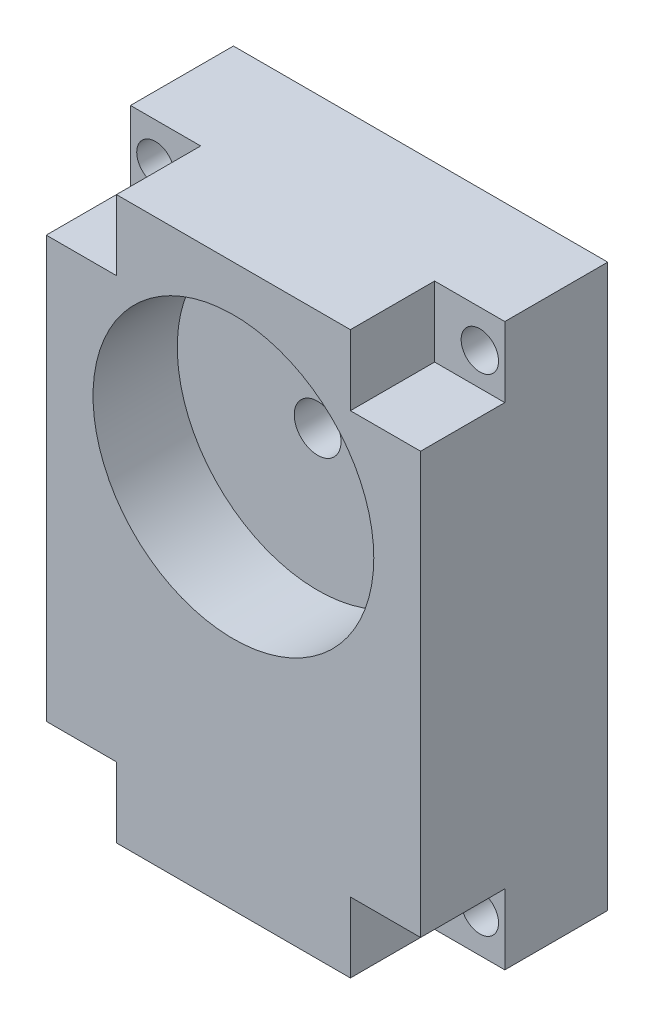
ISO-10303-21;
HEADER;
FILE_DESCRIPTION(('STEP AP214'),'2;1');
FILE_NAME('part.step','',(''),(''),'','','');
FILE_SCHEMA(('AUTOMOTIVE_DESIGN { 1 0 10303 214 1 1 1 1 }'));
ENDSEC;
DATA;
#1=APPLICATION_CONTEXT('core data for automotive mechanical design processes');
#2=APPLICATION_PROTOCOL_DEFINITION('international standard','automotive_design',2000,#1);
#3=PRODUCT_CONTEXT('',#1,'mechanical');
#4=PRODUCT('Part','Part','',(#3));
#5=PRODUCT_RELATED_PRODUCT_CATEGORY('part','',(#4));
#6=PRODUCT_DEFINITION_FORMATION('','',#4);
#7=PRODUCT_DEFINITION_CONTEXT('part definition',#1,'design');
#8=PRODUCT_DEFINITION('design','',#6,#7);
#9=PRODUCT_DEFINITION_SHAPE('','',#8);
#10=(LENGTH_UNIT() NAMED_UNIT(*) SI_UNIT(.MILLI.,.METRE.));
#11=(NAMED_UNIT(*) PLANE_ANGLE_UNIT() SI_UNIT($,.RADIAN.));
#12=(NAMED_UNIT(*) SI_UNIT($,.STERADIAN.) SOLID_ANGLE_UNIT());
#13=UNCERTAINTY_MEASURE_WITH_UNIT(LENGTH_MEASURE(1.E-05),#10,'distance_accuracy_value','');
#14=(GEOMETRIC_REPRESENTATION_CONTEXT(3) GLOBAL_UNCERTAINTY_ASSIGNED_CONTEXT((#13)) GLOBAL_UNIT_ASSIGNED_CONTEXT((#10,
#11,#12)) REPRESENTATION_CONTEXT('',''));
#15=CARTESIAN_POINT('',(0.,0.,0.));
#16=DIRECTION('',(0.,0.,1.));
#17=DIRECTION('',(1.,0.,0.));
#18=AXIS2_PLACEMENT_3D('',#15,#16,#17);
#19=CARTESIAN_POINT('',(0.,0.,0.));
#20=DIRECTION('',(0.,0.,1.));
#21=DIRECTION('',(1.,0.,0.));
#22=AXIS2_PLACEMENT_3D('',#19,#20,#21);
#23=PLANE('',#22);
#24=CARTESIAN_POINT('',(0.,10.125,0.));
#25=DIRECTION('',(0.,0.,1.));
#26=DIRECTION('',(1.,0.,0.));
#27=AXIS2_PLACEMENT_3D('',#24,#25,#26);
#28=CIRCLE('',#27,2.5);
#29=CARTESIAN_POINT('',(2.5,10.125,0.));
#30=VERTEX_POINT('',#29);
#31=EDGE_CURVE('E198',#30,#30,#28,.T.);
#32=ORIENTED_EDGE('',*,*,#31,.T.);
#33=EDGE_LOOP('',(#32));
#34=FACE_BOUND('',#33,.T.);
#35=CARTESIAN_POINT('',(-17.3333333333333,-26.,0.));
#36=DIRECTION('',(0.,0.,1.));
#37=DIRECTION('',(1.,0.,0.));
#38=AXIS2_PLACEMENT_3D('',#35,#36,#37);
#39=CIRCLE('',#38,2.);
#40=CARTESIAN_POINT('',(-15.3333333333333,-26.,0.));
#41=VERTEX_POINT('',#40);
#42=EDGE_CURVE('E290',#41,#41,#39,.T.);
#43=ORIENTED_EDGE('',*,*,#42,.T.);
#44=EDGE_LOOP('',(#43));
#45=FACE_BOUND('',#44,.T.);
#46=CARTESIAN_POINT('',(17.3333333333333,-26.,0.));
#47=DIRECTION('',(0.,0.,1.));
#48=DIRECTION('',(1.,0.,0.));
#49=AXIS2_PLACEMENT_3D('',#46,#47,#48);
#50=CIRCLE('',#49,2.);
#51=CARTESIAN_POINT('',(19.3333333333333,-26.,0.));
#52=VERTEX_POINT('',#51);
#53=EDGE_CURVE('E287',#52,#52,#50,.F.);
#54=ORIENTED_EDGE('',*,*,#53,.F.);
#55=EDGE_LOOP('',(#54));
#56=FACE_BOUND('',#55,.T.);
#57=CARTESIAN_POINT('',(-17.3333333333333,26.,0.));
#58=DIRECTION('',(0.,0.,1.));
#59=DIRECTION('',(1.,0.,0.));
#60=AXIS2_PLACEMENT_3D('',#57,#58,#59);
#61=CIRCLE('',#60,2.);
#62=CARTESIAN_POINT('',(-15.3333333333333,26.,0.));
#63=VERTEX_POINT('',#62);
#64=EDGE_CURVE('E244',#63,#63,#61,.F.);
#65=ORIENTED_EDGE('',*,*,#64,.F.);
#66=EDGE_LOOP('',(#65));
#67=FACE_BOUND('',#66,.T.);
#68=DIRECTION('',(0.,-1.,0.));
#69=VECTOR('',#68,1.);
#70=CARTESIAN_POINT('',(-20.,-30.,0.));
#71=LINE('',#70,#69);
#72=CARTESIAN_POINT('',(-20.,30.,0.));
#73=VERTEX_POINT('',#72);
#74=CARTESIAN_POINT('',(-20.,-30.,0.));
#75=VERTEX_POINT('',#74);
#76=EDGE_CURVE('E252',#73,#75,#71,.T.);
#77=ORIENTED_EDGE('',*,*,#76,.F.);
#78=DIRECTION('',(-1.,0.,0.));
#79=VECTOR('',#78,1.);
#80=CARTESIAN_POINT('',(20.,30.,0.));
#81=LINE('',#80,#79);
#82=CARTESIAN_POINT('',(20.,30.,0.));
#83=VERTEX_POINT('',#82);
#84=EDGE_CURVE('E260',#83,#73,#81,.T.);
#85=ORIENTED_EDGE('',*,*,#84,.F.);
#86=DIRECTION('',(0.,1.,0.));
#87=VECTOR('',#86,1.);
#88=CARTESIAN_POINT('',(20.,-30.,0.));
#89=LINE('',#88,#87);
#90=CARTESIAN_POINT('',(20.,-30.,0.));
#91=VERTEX_POINT('',#90);
#92=EDGE_CURVE('E273',#91,#83,#89,.T.);
#93=ORIENTED_EDGE('',*,*,#92,.F.);
#94=DIRECTION('',(1.,0.,0.));
#95=VECTOR('',#94,1.);
#96=CARTESIAN_POINT('',(20.,-30.,0.));
#97=LINE('',#96,#95);
#98=EDGE_CURVE('E270',#75,#91,#97,.T.);
#99=ORIENTED_EDGE('',*,*,#98,.F.);
#100=EDGE_LOOP('',(#77,#85,#93,#99));
#101=FACE_BOUND('',#100,.T.);
#102=CARTESIAN_POINT('',(17.3333333333333,26.,0.));
#103=DIRECTION('',(0.,0.,1.));
#104=DIRECTION('',(1.,0.,0.));
#105=AXIS2_PLACEMENT_3D('',#102,#103,#104);
#106=CIRCLE('',#105,2.);
#107=CARTESIAN_POINT('',(19.3333333333333,26.,0.));
#108=VERTEX_POINT('',#107);
#109=EDGE_CURVE('E256',#108,#108,#106,.T.);
#110=ORIENTED_EDGE('',*,*,#109,.T.);
#111=EDGE_LOOP('',(#110));
#112=FACE_BOUND('',#111,.T.);
#113=ADVANCED_FACE('F33',(#34,#45,#56,#67,#101,#112),#23,.F.);
#114=CARTESIAN_POINT('',(-20.,-30.,20.));
#115=DIRECTION('',(1.,0.,0.));
#116=DIRECTION('',(0.,0.,-1.));
#117=AXIS2_PLACEMENT_3D('',#114,#115,#116);
#118=PLANE('',#117);
#119=DIRECTION('',(0.,-1.,0.));
#120=VECTOR('',#119,1.);
#121=CARTESIAN_POINT('',(-20.,-30.,11.));
#122=LINE('',#121,#120);
#123=CARTESIAN_POINT('',(-20.,-22.5,11.));
#124=VERTEX_POINT('',#123);
#125=CARTESIAN_POINT('',(-20.,-30.,11.));
#126=VERTEX_POINT('',#125);
#127=EDGE_CURVE('E237',#124,#126,#122,.T.);
#128=ORIENTED_EDGE('',*,*,#127,.F.);
#129=DIRECTION('',(0.,0.,1.));
#130=VECTOR('',#129,1.);
#131=CARTESIAN_POINT('',(-20.,-22.5,20.));
#132=LINE('',#131,#130);
#133=CARTESIAN_POINT('',(-20.,-22.5,20.));
#134=VERTEX_POINT('',#133);
#135=EDGE_CURVE('E221',#124,#134,#132,.T.);
#136=ORIENTED_EDGE('',*,*,#135,.T.);
#137=DIRECTION('',(0.,-1.,0.));
#138=VECTOR('',#137,1.);
#139=CARTESIAN_POINT('',(-20.,-30.,20.));
#140=LINE('',#139,#138);
#141=CARTESIAN_POINT('',(-20.,22.5,20.));
#142=VERTEX_POINT('',#141);
#143=EDGE_CURVE('E257',#142,#134,#140,.T.);
#144=ORIENTED_EDGE('',*,*,#143,.F.);
#145=DIRECTION('',(0.,0.,-1.));
#146=VECTOR('',#145,1.);
#147=CARTESIAN_POINT('',(-20.,22.5,20.));
#148=LINE('',#147,#146);
#149=CARTESIAN_POINT('',(-20.,22.5,11.));
#150=VERTEX_POINT('',#149);
#151=EDGE_CURVE('E153',#142,#150,#148,.T.);
#152=ORIENTED_EDGE('',*,*,#151,.T.);
#153=DIRECTION('',(0.,-1.,0.));
#154=VECTOR('',#153,1.);
#155=CARTESIAN_POINT('',(-20.,-30.,11.));
#156=LINE('',#155,#154);
#157=CARTESIAN_POINT('',(-20.,30.,11.));
#158=VERTEX_POINT('',#157);
#159=EDGE_CURVE('E231',#158,#150,#156,.T.);
#160=ORIENTED_EDGE('',*,*,#159,.F.);
#161=DIRECTION('',(0.,0.,-1.));
#162=VECTOR('',#161,1.);
#163=CARTESIAN_POINT('',(-20.,30.,20.));
#164=LINE('',#163,#162);
#165=EDGE_CURVE('E267',#158,#73,#164,.T.);
#166=ORIENTED_EDGE('',*,*,#165,.T.);
#167=ORIENTED_EDGE('',*,*,#76,.T.);
#168=DIRECTION('',(0.,0.,-1.));
#169=VECTOR('',#168,1.);
#170=CARTESIAN_POINT('',(-20.,-30.,20.));
#171=LINE('',#170,#169);
#172=EDGE_CURVE('E283',#126,#75,#171,.T.);
#173=ORIENTED_EDGE('',*,*,#172,.F.);
#174=EDGE_LOOP('',(#128,#136,#144,#152,#160,#166,#167,#173));
#175=FACE_BOUND('',#174,.T.);
#176=ADVANCED_FACE('F35',(#175),#118,.F.);
#177=CARTESIAN_POINT('',(20.,-30.,20.));
#178=DIRECTION('',(0.,1.,0.));
#179=DIRECTION('',(-1.,0.,0.));
#180=AXIS2_PLACEMENT_3D('',#177,#178,#179);
#181=PLANE('',#180);
#182=DIRECTION('',(1.,0.,0.));
#183=VECTOR('',#182,1.);
#184=CARTESIAN_POINT('',(20.,-30.,11.));
#185=LINE('',#184,#183);
#186=CARTESIAN_POINT('',(12.5,-30.,11.));
#187=VERTEX_POINT('',#186);
#188=CARTESIAN_POINT('',(20.,-30.,11.));
#189=VERTEX_POINT('',#188);
#190=EDGE_CURVE('E234',#187,#189,#185,.T.);
#191=ORIENTED_EDGE('',*,*,#190,.F.);
#192=DIRECTION('',(0.,0.,1.));
#193=VECTOR('',#192,1.);
#194=CARTESIAN_POINT('',(12.5,-30.,20.));
#195=LINE('',#194,#193);
#196=CARTESIAN_POINT('',(12.5,-30.,20.));
#197=VERTEX_POINT('',#196);
#198=EDGE_CURVE('E225',#187,#197,#195,.T.);
#199=ORIENTED_EDGE('',*,*,#198,.T.);
#200=DIRECTION('',(1.,0.,0.));
#201=VECTOR('',#200,1.);
#202=CARTESIAN_POINT('',(20.,-30.,20.));
#203=LINE('',#202,#201);
#204=CARTESIAN_POINT('',(-12.5,-30.,20.));
#205=VERTEX_POINT('',#204);
#206=EDGE_CURVE('E259',#205,#197,#203,.T.);
#207=ORIENTED_EDGE('',*,*,#206,.F.);
#208=DIRECTION('',(0.,0.,-1.));
#209=VECTOR('',#208,1.);
#210=CARTESIAN_POINT('',(-12.5,-30.,20.));
#211=LINE('',#210,#209);
#212=CARTESIAN_POINT('',(-12.5,-30.,11.));
#213=VERTEX_POINT('',#212);
#214=EDGE_CURVE('E218',#205,#213,#211,.T.);
#215=ORIENTED_EDGE('',*,*,#214,.T.);
#216=DIRECTION('',(1.,0.,0.));
#217=VECTOR('',#216,1.);
#218=CARTESIAN_POINT('',(20.,-30.,11.));
#219=LINE('',#218,#217);
#220=EDGE_CURVE('E11',#126,#213,#219,.T.);
#221=ORIENTED_EDGE('',*,*,#220,.F.);
#222=ORIENTED_EDGE('',*,*,#172,.T.);
#223=ORIENTED_EDGE('',*,*,#98,.T.);
#224=DIRECTION('',(0.,0.,-1.));
#225=VECTOR('',#224,1.);
#226=CARTESIAN_POINT('',(20.,-30.,20.));
#227=LINE('',#226,#225);
#228=EDGE_CURVE('E281',#189,#91,#227,.T.);
#229=ORIENTED_EDGE('',*,*,#228,.F.);
#230=EDGE_LOOP('',(#191,#199,#207,#215,#221,#222,#223,#229));
#231=FACE_BOUND('',#230,.T.);
#232=ADVANCED_FACE('F320',(#231),#181,.F.);
#233=CARTESIAN_POINT('',(20.,-30.,20.));
#234=DIRECTION('',(-1.,0.,0.));
#235=DIRECTION('',(0.,0.,1.));
#236=AXIS2_PLACEMENT_3D('',#233,#234,#235);
#237=PLANE('',#236);
#238=DIRECTION('',(0.,1.,0.));
#239=VECTOR('',#238,1.);
#240=CARTESIAN_POINT('',(20.,-30.,20.));
#241=LINE('',#240,#239);
#242=CARTESIAN_POINT('',(20.,-22.5,20.));
#243=VERTEX_POINT('',#242);
#244=CARTESIAN_POINT('',(20.,22.5,20.));
#245=VERTEX_POINT('',#244);
#246=EDGE_CURVE('E263',#243,#245,#241,.T.);
#247=ORIENTED_EDGE('',*,*,#246,.F.);
#248=DIRECTION('',(0.,0.,-1.));
#249=VECTOR('',#248,1.);
#250=CARTESIAN_POINT('',(20.,-22.5,20.));
#251=LINE('',#250,#249);
#252=CARTESIAN_POINT('',(20.,-22.5,11.));
#253=VERTEX_POINT('',#252);
#254=EDGE_CURVE('E56',#243,#253,#251,.T.);
#255=ORIENTED_EDGE('',*,*,#254,.T.);
#256=DIRECTION('',(0.,1.,0.));
#257=VECTOR('',#256,1.);
#258=CARTESIAN_POINT('',(20.,-30.,11.));
#259=LINE('',#258,#257);
#260=EDGE_CURVE('E41',#189,#253,#259,.T.);
#261=ORIENTED_EDGE('',*,*,#260,.F.);
#262=ORIENTED_EDGE('',*,*,#228,.T.);
#263=ORIENTED_EDGE('',*,*,#92,.T.);
#264=DIRECTION('',(0.,0.,-1.));
#265=VECTOR('',#264,1.);
#266=CARTESIAN_POINT('',(20.,30.,20.));
#267=LINE('',#266,#265);
#268=CARTESIAN_POINT('',(20.,30.,11.));
#269=VERTEX_POINT('',#268);
#270=EDGE_CURVE('E279',#269,#83,#267,.T.);
#271=ORIENTED_EDGE('',*,*,#270,.F.);
#272=DIRECTION('',(0.,1.,0.));
#273=VECTOR('',#272,1.);
#274=CARTESIAN_POINT('',(20.,-30.,11.));
#275=LINE('',#274,#273);
#276=CARTESIAN_POINT('',(20.,22.5,11.));
#277=VERTEX_POINT('',#276);
#278=EDGE_CURVE('E228',#277,#269,#275,.T.);
#279=ORIENTED_EDGE('',*,*,#278,.F.);
#280=DIRECTION('',(0.,0.,1.));
#281=VECTOR('',#280,1.);
#282=CARTESIAN_POINT('',(20.,22.5,20.));
#283=LINE('',#282,#281);
#284=EDGE_CURVE('E209',#277,#245,#283,.T.);
#285=ORIENTED_EDGE('',*,*,#284,.T.);
#286=EDGE_LOOP('',(#247,#255,#261,#262,#263,#271,#279,#285));
#287=FACE_BOUND('',#286,.T.);
#288=ADVANCED_FACE('F314',(#287),#237,.F.);
#289=CARTESIAN_POINT('',(20.,30.,20.));
#290=DIRECTION('',(0.,-1.,0.));
#291=DIRECTION('',(0.,0.,-1.));
#292=AXIS2_PLACEMENT_3D('',#289,#290,#291);
#293=PLANE('',#292);
#294=DIRECTION('',(-1.,0.,0.));
#295=VECTOR('',#294,1.);
#296=CARTESIAN_POINT('',(20.,30.,11.));
#297=LINE('',#296,#295);
#298=CARTESIAN_POINT('',(-12.5,30.,11.));
#299=VERTEX_POINT('',#298);
#300=EDGE_CURVE('E301',#299,#158,#297,.T.);
#301=ORIENTED_EDGE('',*,*,#300,.F.);
#302=DIRECTION('',(0.,0.,1.));
#303=VECTOR('',#302,1.);
#304=CARTESIAN_POINT('',(-12.5,30.,20.));
#305=LINE('',#304,#303);
#306=CARTESIAN_POINT('',(-12.5,30.,20.));
#307=VERTEX_POINT('',#306);
#308=EDGE_CURVE('E216',#299,#307,#305,.T.);
#309=ORIENTED_EDGE('',*,*,#308,.T.);
#310=DIRECTION('',(-1.,0.,0.));
#311=VECTOR('',#310,1.);
#312=CARTESIAN_POINT('',(20.,30.,20.));
#313=LINE('',#312,#311);
#314=CARTESIAN_POINT('',(12.5,30.,20.));
#315=VERTEX_POINT('',#314);
#316=EDGE_CURVE('E174',#315,#307,#313,.T.);
#317=ORIENTED_EDGE('',*,*,#316,.F.);
#318=DIRECTION('',(0.,0.,-1.));
#319=VECTOR('',#318,1.);
#320=CARTESIAN_POINT('',(12.5,30.,20.));
#321=LINE('',#320,#319);
#322=CARTESIAN_POINT('',(12.5,30.,11.));
#323=VERTEX_POINT('',#322);
#324=EDGE_CURVE('E212',#315,#323,#321,.T.);
#325=ORIENTED_EDGE('',*,*,#324,.T.);
#326=DIRECTION('',(-1.,0.,0.));
#327=VECTOR('',#326,1.);
#328=CARTESIAN_POINT('',(20.,30.,11.));
#329=LINE('',#328,#327);
#330=EDGE_CURVE('E299',#269,#323,#329,.T.);
#331=ORIENTED_EDGE('',*,*,#330,.F.);
#332=ORIENTED_EDGE('',*,*,#270,.T.);
#333=ORIENTED_EDGE('',*,*,#84,.T.);
#334=ORIENTED_EDGE('',*,*,#165,.F.);
#335=EDGE_LOOP('',(#301,#309,#317,#325,#331,#332,#333,#334));
#336=FACE_BOUND('',#335,.T.);
#337=ADVANCED_FACE('F332',(#336),#293,.F.);
#338=CARTESIAN_POINT('',(0.,0.,20.));
#339=DIRECTION('',(0.,0.,1.));
#340=DIRECTION('',(1.,0.,0.));
#341=AXIS2_PLACEMENT_3D('',#338,#339,#340);
#342=PLANE('',#341);
#343=DIRECTION('',(0.,-1.,0.));
#344=VECTOR('',#343,1.);
#345=CARTESIAN_POINT('',(12.5,-37.5,20.));
#346=LINE('',#345,#344);
#347=CARTESIAN_POINT('',(12.5,-22.5,20.));
#348=VERTEX_POINT('',#347);
#349=EDGE_CURVE('E196',#348,#197,#346,.T.);
#350=ORIENTED_EDGE('',*,*,#349,.F.);
#351=DIRECTION('',(-1.,0.,0.));
#352=VECTOR('',#351,1.);
#353=CARTESIAN_POINT('',(0.,-22.5,20.));
#354=LINE('',#353,#352);
#355=EDGE_CURVE('E297',#243,#348,#354,.T.);
#356=ORIENTED_EDGE('',*,*,#355,.F.);
#357=ORIENTED_EDGE('',*,*,#246,.T.);
#358=DIRECTION('',(1.,0.,0.));
#359=VECTOR('',#358,1.);
#360=CARTESIAN_POINT('',(27.5,22.5,20.));
#361=LINE('',#360,#359);
#362=CARTESIAN_POINT('',(12.5,22.5,20.));
#363=VERTEX_POINT('',#362);
#364=EDGE_CURVE('E184',#363,#245,#361,.T.);
#365=ORIENTED_EDGE('',*,*,#364,.F.);
#366=DIRECTION('',(0.,-1.,0.));
#367=VECTOR('',#366,1.);
#368=CARTESIAN_POINT('',(12.5,0.,20.));
#369=LINE('',#368,#367);
#370=EDGE_CURVE('E159',#315,#363,#369,.T.);
#371=ORIENTED_EDGE('',*,*,#370,.F.);
#372=ORIENTED_EDGE('',*,*,#316,.T.);
#373=DIRECTION('',(0.,1.,0.));
#374=VECTOR('',#373,1.);
#375=CARTESIAN_POINT('',(-12.5,37.5,20.));
#376=LINE('',#375,#374);
#377=CARTESIAN_POINT('',(-12.5,22.5,20.));
#378=VERTEX_POINT('',#377);
#379=EDGE_CURVE('E163',#378,#307,#376,.T.);
#380=ORIENTED_EDGE('',*,*,#379,.F.);
#381=DIRECTION('',(1.,0.,0.));
#382=VECTOR('',#381,1.);
#383=CARTESIAN_POINT('',(0.,22.5,20.));
#384=LINE('',#383,#382);
#385=EDGE_CURVE('E146',#142,#378,#384,.T.);
#386=ORIENTED_EDGE('',*,*,#385,.F.);
#387=ORIENTED_EDGE('',*,*,#143,.T.);
#388=DIRECTION('',(-1.,0.,0.));
#389=VECTOR('',#388,1.);
#390=CARTESIAN_POINT('',(-27.5,-22.5,20.));
#391=LINE('',#390,#389);
#392=CARTESIAN_POINT('',(-12.5,-22.5,20.));
#393=VERTEX_POINT('',#392);
#394=EDGE_CURVE('E188',#393,#134,#391,.T.);
#395=ORIENTED_EDGE('',*,*,#394,.F.);
#396=DIRECTION('',(0.,1.,0.));
#397=VECTOR('',#396,1.);
#398=CARTESIAN_POINT('',(-12.5,0.,20.));
#399=LINE('',#398,#397);
#400=EDGE_CURVE('E158',#205,#393,#399,.T.);
#401=ORIENTED_EDGE('',*,*,#400,.F.);
#402=ORIENTED_EDGE('',*,*,#206,.T.);
#403=EDGE_LOOP('',(#350,#356,#357,#365,#371,#372,#380,#386,#387,#395,#401,#402));
#404=FACE_BOUND('',#403,.T.);
#405=CARTESIAN_POINT('',(0.,10.125,20.));
#406=DIRECTION('',(0.,0.,1.));
#407=DIRECTION('',(1.,0.,0.));
#408=AXIS2_PLACEMENT_3D('',#405,#406,#407);
#409=CIRCLE('',#408,15.);
#410=CARTESIAN_POINT('',(15.,10.125,20.));
#411=VERTEX_POINT('',#410);
#412=EDGE_CURVE('E253',#411,#411,#409,.T.);
#413=ORIENTED_EDGE('',*,*,#412,.F.);
#414=EDGE_LOOP('',(#413));
#415=FACE_BOUND('',#414,.T.);
#416=ADVANCED_FACE('F170',(#404,#415),#342,.T.);
#417=CARTESIAN_POINT('',(0.,10.125,11.));
#418=DIRECTION('',(0.,0.,1.));
#419=DIRECTION('',(1.,0.,0.));
#420=AXIS2_PLACEMENT_3D('',#417,#418,#419);
#421=CYLINDRICAL_SURFACE('',#420,15.);
#422=CARTESIAN_POINT('',(0.,10.125,11.));
#423=DIRECTION('',(0.,0.,1.));
#424=DIRECTION('',(1.,0.,0.));
#425=AXIS2_PLACEMENT_3D('',#422,#423,#424);
#426=CIRCLE('',#425,15.);
#427=CARTESIAN_POINT('',(15.,10.125,11.));
#428=VERTEX_POINT('',#427);
#429=EDGE_CURVE('E249',#428,#428,#426,.T.);
#430=ORIENTED_EDGE('',*,*,#429,.F.);
#431=EDGE_LOOP('',(#430));
#432=FACE_BOUND('',#431,.T.);
#433=ORIENTED_EDGE('',*,*,#412,.T.);
#434=EDGE_LOOP('',(#433));
#435=FACE_BOUND('',#434,.T.);
#436=ADVANCED_FACE('F403',(#432,#435),#421,.F.);
#437=CARTESIAN_POINT('',(0.,10.125,11.));
#438=DIRECTION('',(0.,0.,1.));
#439=DIRECTION('',(1.,0.,0.));
#440=AXIS2_PLACEMENT_3D('',#437,#438,#439);
#441=PLANE('',#440);
#442=CARTESIAN_POINT('',(0.,10.125,11.));
#443=DIRECTION('',(0.,0.,1.));
#444=DIRECTION('',(1.,0.,0.));
#445=AXIS2_PLACEMENT_3D('',#442,#443,#444);
#446=CIRCLE('',#445,2.5);
#447=CARTESIAN_POINT('',(2.5,10.125,11.));
#448=VERTEX_POINT('',#447);
#449=EDGE_CURVE('E582',#448,#448,#446,.T.);
#450=ORIENTED_EDGE('',*,*,#449,.F.);
#451=EDGE_LOOP('',(#450));
#452=FACE_BOUND('',#451,.T.);
#453=ORIENTED_EDGE('',*,*,#429,.T.);
#454=EDGE_LOOP('',(#453));
#455=FACE_BOUND('',#454,.T.);
#456=ADVANCED_FACE('F410',(#452,#455),#441,.T.);
#457=CARTESIAN_POINT('',(-17.3333333333333,26.,-21.));
#458=DIRECTION('',(0.,0.,1.));
#459=DIRECTION('',(1.,0.,0.));
#460=AXIS2_PLACEMENT_3D('',#457,#458,#459);
#461=CYLINDRICAL_SURFACE('',#460,2.);
#462=CARTESIAN_POINT('',(-17.3333333333333,26.,11.));
#463=DIRECTION('',(0.,0.,-1.));
#464=DIRECTION('',(-1.,0.,0.));
#465=AXIS2_PLACEMENT_3D('',#462,#463,#464);
#466=CIRCLE('',#465,2.);
#467=CARTESIAN_POINT('',(-19.3333333333333,26.,11.));
#468=VERTEX_POINT('',#467);
#469=EDGE_CURVE('E233',#468,#468,#466,.T.);
#470=ORIENTED_EDGE('',*,*,#469,.F.);
#471=EDGE_LOOP('',(#470));
#472=FACE_BOUND('',#471,.T.);
#473=ORIENTED_EDGE('',*,*,#64,.T.);
#474=EDGE_LOOP('',(#473));
#475=FACE_BOUND('',#474,.T.);
#476=ADVANCED_FACE('F418',(#472,#475),#461,.F.);
#477=CARTESIAN_POINT('',(17.3333333333333,-26.,-21.));
#478=DIRECTION('',(0.,0.,1.));
#479=DIRECTION('',(1.,0.,0.));
#480=AXIS2_PLACEMENT_3D('',#477,#478,#479);
#481=CYLINDRICAL_SURFACE('',#480,2.);
#482=CARTESIAN_POINT('',(17.3333333333333,-26.,11.));
#483=DIRECTION('',(0.,0.,-1.));
#484=DIRECTION('',(-1.,0.,0.));
#485=AXIS2_PLACEMENT_3D('',#482,#483,#484);
#486=CIRCLE('',#485,2.);
#487=CARTESIAN_POINT('',(15.3333333333333,-26.,11.));
#488=VERTEX_POINT('',#487);
#489=EDGE_CURVE('E236',#488,#488,#486,.T.);
#490=ORIENTED_EDGE('',*,*,#489,.F.);
#491=EDGE_LOOP('',(#490));
#492=FACE_BOUND('',#491,.T.);
#493=ORIENTED_EDGE('',*,*,#53,.T.);
#494=EDGE_LOOP('',(#493));
#495=FACE_BOUND('',#494,.T.);
#496=ADVANCED_FACE('F426',(#492,#495),#481,.F.);
#497=CARTESIAN_POINT('',(-17.3333333333333,-26.,-21.));
#498=DIRECTION('',(0.,0.,1.));
#499=DIRECTION('',(1.,0.,0.));
#500=AXIS2_PLACEMENT_3D('',#497,#498,#499);
#501=CYLINDRICAL_SURFACE('',#500,2.);
#502=CARTESIAN_POINT('',(-17.3333333333333,-26.,11.));
#503=DIRECTION('',(0.,0.,1.));
#504=DIRECTION('',(1.,0.,0.));
#505=AXIS2_PLACEMENT_3D('',#502,#503,#504);
#506=CIRCLE('',#505,2.);
#507=CARTESIAN_POINT('',(-15.3333333333333,-26.,11.));
#508=VERTEX_POINT('',#507);
#509=EDGE_CURVE('E239',#508,#508,#506,.T.);
#510=ORIENTED_EDGE('',*,*,#509,.T.);
#511=EDGE_LOOP('',(#510));
#512=FACE_BOUND('',#511,.T.);
#513=ORIENTED_EDGE('',*,*,#42,.F.);
#514=EDGE_LOOP('',(#513));
#515=FACE_BOUND('',#514,.T.);
#516=ADVANCED_FACE('F434',(#512,#515),#501,.F.);
#517=CARTESIAN_POINT('',(17.3333333333333,26.,-21.));
#518=DIRECTION('',(0.,0.,1.));
#519=DIRECTION('',(1.,0.,0.));
#520=AXIS2_PLACEMENT_3D('',#517,#518,#519);
#521=CYLINDRICAL_SURFACE('',#520,2.);
#522=CARTESIAN_POINT('',(17.3333333333333,26.,11.));
#523=DIRECTION('',(0.,0.,1.));
#524=DIRECTION('',(1.,0.,0.));
#525=AXIS2_PLACEMENT_3D('',#522,#523,#524);
#526=CIRCLE('',#525,2.);
#527=CARTESIAN_POINT('',(19.3333333333333,26.,11.));
#528=VERTEX_POINT('',#527);
#529=EDGE_CURVE('E230',#528,#528,#526,.T.);
#530=ORIENTED_EDGE('',*,*,#529,.T.);
#531=EDGE_LOOP('',(#530));
#532=FACE_BOUND('',#531,.T.);
#533=ORIENTED_EDGE('',*,*,#109,.F.);
#534=EDGE_LOOP('',(#533));
#535=FACE_BOUND('',#534,.T.);
#536=ADVANCED_FACE('F442',(#532,#535),#521,.F.);
#537=CARTESIAN_POINT('',(0.,10.125,11.));
#538=DIRECTION('',(0.,0.,1.));
#539=DIRECTION('',(1.,0.,0.));
#540=AXIS2_PLACEMENT_3D('',#537,#538,#539);
#541=PLANE('',#540);
#542=ORIENTED_EDGE('',*,*,#529,.F.);
#543=EDGE_LOOP('',(#542));
#544=FACE_BOUND('',#543,.T.);
#545=ORIENTED_EDGE('',*,*,#278,.T.);
#546=ORIENTED_EDGE('',*,*,#330,.T.);
#547=DIRECTION('',(0.,1.,0.));
#548=VECTOR('',#547,1.);
#549=CARTESIAN_POINT('',(12.5,37.5,11.));
#550=LINE('',#549,#548);
#551=CARTESIAN_POINT('',(12.5,22.5,11.));
#552=VERTEX_POINT('',#551);
#553=EDGE_CURVE('E202',#552,#323,#550,.T.);
#554=ORIENTED_EDGE('',*,*,#553,.F.);
#555=DIRECTION('',(-1.,0.,0.));
#556=VECTOR('',#555,1.);
#557=CARTESIAN_POINT('',(27.5,22.5,11.));
#558=LINE('',#557,#556);
#559=EDGE_CURVE('E205',#277,#552,#558,.T.);
#560=ORIENTED_EDGE('',*,*,#559,.F.);
#561=EDGE_LOOP('',(#545,#546,#554,#560));
#562=FACE_BOUND('',#561,.T.);
#563=ADVANCED_FACE('F336',(#544,#562),#541,.T.);
#564=CARTESIAN_POINT('',(12.5,37.5,-10.2132034355964));
#565=DIRECTION('',(-1.,0.,0.));
#566=DIRECTION('',(0.,-1.,0.));
#567=AXIS2_PLACEMENT_3D('',#564,#565,#566);
#568=PLANE('',#567);
#569=ORIENTED_EDGE('',*,*,#370,.T.);
#570=DIRECTION('',(0.,0.,1.));
#571=VECTOR('',#570,1.);
#572=CARTESIAN_POINT('',(12.5,22.5,-10.2132034355964));
#573=LINE('',#572,#571);
#574=EDGE_CURVE('E48',#552,#363,#573,.T.);
#575=ORIENTED_EDGE('',*,*,#574,.F.);
#576=ORIENTED_EDGE('',*,*,#553,.T.);
#577=ORIENTED_EDGE('',*,*,#324,.F.);
#578=EDGE_LOOP('',(#569,#575,#576,#577));
#579=FACE_BOUND('',#578,.T.);
#580=ADVANCED_FACE('F339',(#579),#568,.F.);
#581=CARTESIAN_POINT('',(27.5,22.5,-10.2132034355964));
#582=DIRECTION('',(0.,-1.,0.));
#583=DIRECTION('',(0.,0.,-1.));
#584=AXIS2_PLACEMENT_3D('',#581,#582,#583);
#585=PLANE('',#584);
#586=ORIENTED_EDGE('',*,*,#559,.T.);
#587=ORIENTED_EDGE('',*,*,#574,.T.);
#588=ORIENTED_EDGE('',*,*,#364,.T.);
#589=ORIENTED_EDGE('',*,*,#284,.F.);
#590=EDGE_LOOP('',(#586,#587,#588,#589));
#591=FACE_BOUND('',#590,.T.);
#592=ADVANCED_FACE('F463',(#591),#585,.F.);
#593=CARTESIAN_POINT('',(0.,10.125,11.));
#594=DIRECTION('',(0.,0.,1.));
#595=DIRECTION('',(1.,0.,0.));
#596=AXIS2_PLACEMENT_3D('',#593,#594,#595);
#597=PLANE('',#596);
#598=ORIENTED_EDGE('',*,*,#159,.T.);
#599=DIRECTION('',(-1.,0.,0.));
#600=VECTOR('',#599,1.);
#601=CARTESIAN_POINT('',(-27.5,22.5,11.));
#602=LINE('',#601,#600);
#603=CARTESIAN_POINT('',(-12.5,22.5,11.));
#604=VERTEX_POINT('',#603);
#605=EDGE_CURVE('E182',#604,#150,#602,.T.);
#606=ORIENTED_EDGE('',*,*,#605,.F.);
#607=DIRECTION('',(0.,-1.,0.));
#608=VECTOR('',#607,1.);
#609=CARTESIAN_POINT('',(-12.5,37.5,11.));
#610=LINE('',#609,#608);
#611=EDGE_CURVE('E166',#299,#604,#610,.T.);
#612=ORIENTED_EDGE('',*,*,#611,.F.);
#613=ORIENTED_EDGE('',*,*,#300,.T.);
#614=EDGE_LOOP('',(#598,#606,#612,#613));
#615=FACE_BOUND('',#614,.T.);
#616=ORIENTED_EDGE('',*,*,#469,.T.);
#617=EDGE_LOOP('',(#616));
#618=FACE_BOUND('',#617,.T.);
#619=ADVANCED_FACE('F341',(#615,#618),#597,.T.);
#620=CARTESIAN_POINT('',(-12.5,37.5,-10.2132034355964));
#621=DIRECTION('',(1.,0.,0.));
#622=DIRECTION('',(0.,1.,0.));
#623=AXIS2_PLACEMENT_3D('',#620,#621,#622);
#624=PLANE('',#623);
#625=ORIENTED_EDGE('',*,*,#611,.T.);
#626=DIRECTION('',(0.,0.,1.));
#627=VECTOR('',#626,1.);
#628=CARTESIAN_POINT('',(-12.5,22.5,-10.2132034355964));
#629=LINE('',#628,#627);
#630=EDGE_CURVE('E150',#604,#378,#629,.T.);
#631=ORIENTED_EDGE('',*,*,#630,.T.);
#632=ORIENTED_EDGE('',*,*,#379,.T.);
#633=ORIENTED_EDGE('',*,*,#308,.F.);
#634=EDGE_LOOP('',(#625,#631,#632,#633));
#635=FACE_BOUND('',#634,.T.);
#636=ADVANCED_FACE('F162',(#635),#624,.F.);
#637=CARTESIAN_POINT('',(-27.5,22.5,-10.2132034355964));
#638=DIRECTION('',(0.,-1.,0.));
#639=DIRECTION('',(0.,0.,-1.));
#640=AXIS2_PLACEMENT_3D('',#637,#638,#639);
#641=PLANE('',#640);
#642=ORIENTED_EDGE('',*,*,#385,.T.);
#643=ORIENTED_EDGE('',*,*,#630,.F.);
#644=ORIENTED_EDGE('',*,*,#605,.T.);
#645=ORIENTED_EDGE('',*,*,#151,.F.);
#646=EDGE_LOOP('',(#642,#643,#644,#645));
#647=FACE_BOUND('',#646,.T.);
#648=ADVANCED_FACE('F148',(#647),#641,.F.);
#649=CARTESIAN_POINT('',(0.,10.125,11.));
#650=DIRECTION('',(0.,0.,1.));
#651=DIRECTION('',(1.,0.,0.));
#652=AXIS2_PLACEMENT_3D('',#649,#650,#651);
#653=PLANE('',#652);
#654=ORIENTED_EDGE('',*,*,#509,.F.);
#655=EDGE_LOOP('',(#654));
#656=FACE_BOUND('',#655,.T.);
#657=ORIENTED_EDGE('',*,*,#127,.T.);
#658=ORIENTED_EDGE('',*,*,#220,.T.);
#659=DIRECTION('',(0.,-1.,0.));
#660=VECTOR('',#659,1.);
#661=CARTESIAN_POINT('',(-12.5,-37.5,11.));
#662=LINE('',#661,#660);
#663=CARTESIAN_POINT('',(-12.5,-22.5,11.));
#664=VERTEX_POINT('',#663);
#665=EDGE_CURVE('E177',#664,#213,#662,.T.);
#666=ORIENTED_EDGE('',*,*,#665,.F.);
#667=DIRECTION('',(1.,0.,0.));
#668=VECTOR('',#667,1.);
#669=CARTESIAN_POINT('',(-27.5,-22.5,11.));
#670=LINE('',#669,#668);
#671=EDGE_CURVE('E175',#124,#664,#670,.T.);
#672=ORIENTED_EDGE('',*,*,#671,.F.);
#673=EDGE_LOOP('',(#657,#658,#666,#672));
#674=FACE_BOUND('',#673,.T.);
#675=ADVANCED_FACE('F358',(#656,#674),#653,.T.);
#676=CARTESIAN_POINT('',(-27.5,-22.5,-10.2132034355964));
#677=DIRECTION('',(0.,1.,0.));
#678=DIRECTION('',(0.,0.,1.));
#679=AXIS2_PLACEMENT_3D('',#676,#677,#678);
#680=PLANE('',#679);
#681=ORIENTED_EDGE('',*,*,#671,.T.);
#682=DIRECTION('',(0.,0.,1.));
#683=VECTOR('',#682,1.);
#684=CARTESIAN_POINT('',(-12.5,-22.5,-10.2132034355964));
#685=LINE('',#684,#683);
#686=EDGE_CURVE('E186',#664,#393,#685,.T.);
#687=ORIENTED_EDGE('',*,*,#686,.T.);
#688=ORIENTED_EDGE('',*,*,#394,.T.);
#689=ORIENTED_EDGE('',*,*,#135,.F.);
#690=EDGE_LOOP('',(#681,#687,#688,#689));
#691=FACE_BOUND('',#690,.T.);
#692=ADVANCED_FACE('F349',(#691),#680,.F.);
#693=CARTESIAN_POINT('',(-12.5,-37.5,-10.2132034355964));
#694=DIRECTION('',(1.,0.,0.));
#695=DIRECTION('',(0.,1.,0.));
#696=AXIS2_PLACEMENT_3D('',#693,#694,#695);
#697=PLANE('',#696);
#698=ORIENTED_EDGE('',*,*,#400,.T.);
#699=ORIENTED_EDGE('',*,*,#686,.F.);
#700=ORIENTED_EDGE('',*,*,#665,.T.);
#701=ORIENTED_EDGE('',*,*,#214,.F.);
#702=EDGE_LOOP('',(#698,#699,#700,#701));
#703=FACE_BOUND('',#702,.T.);
#704=ADVANCED_FACE('F354',(#703),#697,.F.);
#705=CARTESIAN_POINT('',(0.,10.125,11.));
#706=DIRECTION('',(0.,0.,1.));
#707=DIRECTION('',(1.,0.,0.));
#708=AXIS2_PLACEMENT_3D('',#705,#706,#707);
#709=PLANE('',#708);
#710=ORIENTED_EDGE('',*,*,#190,.T.);
#711=ORIENTED_EDGE('',*,*,#260,.T.);
#712=DIRECTION('',(1.,0.,0.));
#713=VECTOR('',#712,1.);
#714=CARTESIAN_POINT('',(27.5,-22.5,11.));
#715=LINE('',#714,#713);
#716=CARTESIAN_POINT('',(12.5,-22.5,11.));
#717=VERTEX_POINT('',#716);
#718=EDGE_CURVE('E190',#717,#253,#715,.T.);
#719=ORIENTED_EDGE('',*,*,#718,.F.);
#720=DIRECTION('',(0.,1.,0.));
#721=VECTOR('',#720,1.);
#722=CARTESIAN_POINT('',(12.5,-37.5,11.));
#723=LINE('',#722,#721);
#724=EDGE_CURVE('E193',#187,#717,#723,.T.);
#725=ORIENTED_EDGE('',*,*,#724,.F.);
#726=EDGE_LOOP('',(#710,#711,#719,#725));
#727=FACE_BOUND('',#726,.T.);
#728=ORIENTED_EDGE('',*,*,#489,.T.);
#729=EDGE_LOOP('',(#728));
#730=FACE_BOUND('',#729,.T.);
#731=ADVANCED_FACE('F305',(#727,#730),#709,.T.);
#732=CARTESIAN_POINT('',(12.5,-37.5,-10.2132034355964));
#733=DIRECTION('',(-1.,0.,0.));
#734=DIRECTION('',(0.,-1.,0.));
#735=AXIS2_PLACEMENT_3D('',#732,#733,#734);
#736=PLANE('',#735);
#737=ORIENTED_EDGE('',*,*,#724,.T.);
#738=DIRECTION('',(0.,0.,1.));
#739=VECTOR('',#738,1.);
#740=CARTESIAN_POINT('',(12.5,-22.5,-10.2132034355964));
#741=LINE('',#740,#739);
#742=EDGE_CURVE('E195',#717,#348,#741,.T.);
#743=ORIENTED_EDGE('',*,*,#742,.T.);
#744=ORIENTED_EDGE('',*,*,#349,.T.);
#745=ORIENTED_EDGE('',*,*,#198,.F.);
#746=EDGE_LOOP('',(#737,#743,#744,#745));
#747=FACE_BOUND('',#746,.T.);
#748=ADVANCED_FACE('F318',(#747),#736,.F.);
#749=CARTESIAN_POINT('',(27.5,-22.5,-10.2132034355964));
#750=DIRECTION('',(0.,1.,0.));
#751=DIRECTION('',(0.,0.,1.));
#752=AXIS2_PLACEMENT_3D('',#749,#750,#751);
#753=PLANE('',#752);
#754=ORIENTED_EDGE('',*,*,#355,.T.);
#755=ORIENTED_EDGE('',*,*,#742,.F.);
#756=ORIENTED_EDGE('',*,*,#718,.T.);
#757=ORIENTED_EDGE('',*,*,#254,.F.);
#758=EDGE_LOOP('',(#754,#755,#756,#757));
#759=FACE_BOUND('',#758,.T.);
#760=ADVANCED_FACE('F312',(#759),#753,.F.);
#761=CARTESIAN_POINT('',(0.,10.125,0.));
#762=DIRECTION('',(0.,0.,1.));
#763=DIRECTION('',(1.,0.,0.));
#764=AXIS2_PLACEMENT_3D('',#761,#762,#763);
#765=CYLINDRICAL_SURFACE('',#764,2.5);
#766=ORIENTED_EDGE('',*,*,#31,.F.);
#767=EDGE_LOOP('',(#766));
#768=FACE_BOUND('',#767,.T.);
#769=ORIENTED_EDGE('',*,*,#449,.T.);
#770=EDGE_LOOP('',(#769));
#771=FACE_BOUND('',#770,.T.);
#772=ADVANCED_FACE('F527',(#768,#771),#765,.F.);
#773=CLOSED_SHELL('',(#113,#176,#232,#288,#337,#416,#436,#456,#476,#496,#516,#536,#563,#580,
#592,#619,#636,#648,#675,#692,#704,#731,#748,#760,#772));
#774=MANIFOLD_SOLID_BREP('B2',#773);
#775=ADVANCED_BREP_SHAPE_REPRESENTATION('',(#18,#774),#14);
#776=SHAPE_DEFINITION_REPRESENTATION(#9,#775);
ENDSEC;
END-ISO-10303-21;
